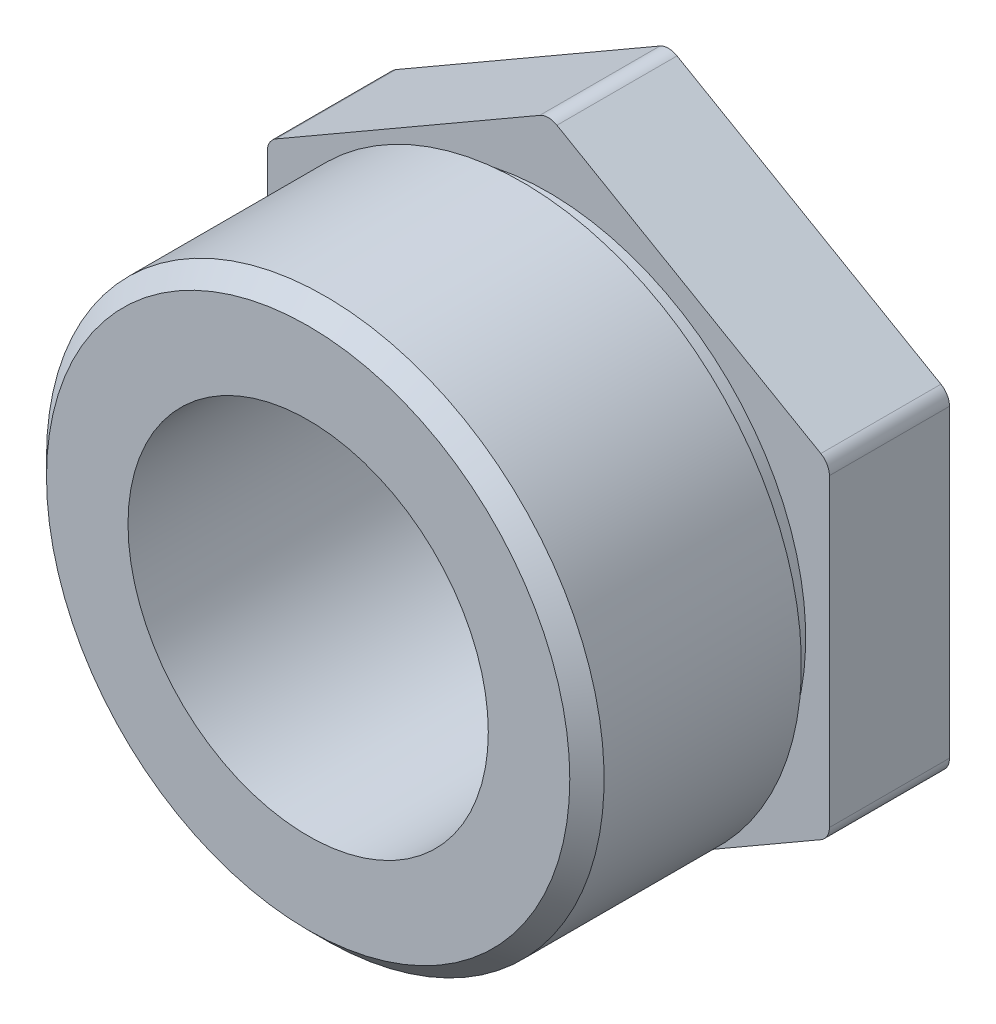
ISO-10303-21;
HEADER;
FILE_DESCRIPTION(('STEP AP214'),'2;1');
FILE_NAME('part.step','',(''),(''),'','','');
FILE_SCHEMA(('AUTOMOTIVE_DESIGN { 1 0 10303 214 1 1 1 1 }'));
ENDSEC;
DATA;
#1=APPLICATION_CONTEXT('core data for automotive mechanical design processes');
#2=APPLICATION_PROTOCOL_DEFINITION('international standard','automotive_design',2000,#1);
#3=PRODUCT_CONTEXT('',#1,'mechanical');
#4=PRODUCT('Part','Part','',(#3));
#5=PRODUCT_RELATED_PRODUCT_CATEGORY('part','',(#4));
#6=PRODUCT_DEFINITION_FORMATION('','',#4);
#7=PRODUCT_DEFINITION_CONTEXT('part definition',#1,'design');
#8=PRODUCT_DEFINITION('design','',#6,#7);
#9=PRODUCT_DEFINITION_SHAPE('','',#8);
#10=(LENGTH_UNIT() NAMED_UNIT(*) SI_UNIT(.MILLI.,.METRE.));
#11=(NAMED_UNIT(*) PLANE_ANGLE_UNIT() SI_UNIT($,.RADIAN.));
#12=(NAMED_UNIT(*) SI_UNIT($,.STERADIAN.) SOLID_ANGLE_UNIT());
#13=UNCERTAINTY_MEASURE_WITH_UNIT(LENGTH_MEASURE(1.E-05),#10,'distance_accuracy_value','');
#14=(GEOMETRIC_REPRESENTATION_CONTEXT(3) GLOBAL_UNCERTAINTY_ASSIGNED_CONTEXT((#13)) GLOBAL_UNIT_ASSIGNED_CONTEXT((#10,
#11,#12)) REPRESENTATION_CONTEXT('',''));
#15=CARTESIAN_POINT('',(0.,0.,0.));
#16=DIRECTION('',(0.,0.,1.));
#17=DIRECTION('',(1.,0.,0.));
#18=AXIS2_PLACEMENT_3D('',#15,#16,#17);
#19=CARTESIAN_POINT('',(-4.44089209850063E-13,0.,42.));
#20=DIRECTION('',(0.,0.,-1.));
#21=DIRECTION('',(-0.999999999999999,0.,0.));
#22=AXIS2_PLACEMENT_3D('',#19,#20,#21);
#23=CYLINDRICAL_SURFACE('',#22,32.5);
#24=CARTESIAN_POINT('',(-5.55111512312578E-13,-4.44089209850063E-13,40.));
#25=DIRECTION('',(0.,0.,1.));
#26=DIRECTION('',(0.999999999999999,0.,0.));
#27=AXIS2_PLACEMENT_3D('',#24,#25,#26);
#28=CIRCLE('',#27,32.5);
#29=CARTESIAN_POINT('',(-32.5000000000004,0.,40.));
#30=VERTEX_POINT('',#29);
#31=EDGE_CURVE('E13',#30,#30,#28,.F.);
#32=CARTESIAN_POINT('',(0.,0.,17.0000000000006));
#33=DIRECTION('',(0.,0.,1.));
#34=DIRECTION('',(0.999999999999999,0.,0.));
#35=AXIS2_PLACEMENT_3D('',#32,#33,#34);
#36=CIRCLE('',#35,32.5);
#37=CARTESIAN_POINT('',(-32.5000000000004,0.,17.0000000000006));
#38=VERTEX_POINT('',#37);
#39=EDGE_CURVE('E179',#38,#38,#36,.T.);
#40=CARTESIAN_POINT('',(-32.5000000000004,0.,40.));
#41=CARTESIAN_POINT('',(-32.5000000000004,0.,39.7604166666667));
#42=CARTESIAN_POINT('',(-32.5000000000004,0.,39.5208333333334));
#43=CARTESIAN_POINT('',(-32.5000000000004,0.,39.0416666666667));
#44=CARTESIAN_POINT('',(-32.5000000000004,0.,38.8020833333334));
#45=CARTESIAN_POINT('',(-32.5000000000004,0.,38.3229166666667));
#46=CARTESIAN_POINT('',(-32.5000000000004,0.,38.0833333333334));
#47=CARTESIAN_POINT('',(-32.5000000000004,0.,37.6041666666668));
#48=CARTESIAN_POINT('',(-32.5000000000004,0.,37.3645833333334));
#49=CARTESIAN_POINT('',(-32.5000000000004,0.,36.8854166666668));
#50=CARTESIAN_POINT('',(-32.5000000000004,0.,36.6458333333334));
#51=CARTESIAN_POINT('',(-32.5000000000004,0.,36.1666666666668));
#52=CARTESIAN_POINT('',(-32.5000000000004,0.,35.9270833333335));
#53=CARTESIAN_POINT('',(-32.5000000000004,0.,35.4479166666668));
#54=CARTESIAN_POINT('',(-32.5000000000004,0.,35.2083333333335));
#55=CARTESIAN_POINT('',(-32.5000000000004,0.,34.7291666666668));
#56=CARTESIAN_POINT('',(-32.5000000000004,0.,34.4895833333335));
#57=CARTESIAN_POINT('',(-32.5000000000004,0.,34.0104166666668));
#58=CARTESIAN_POINT('',(-32.5000000000004,0.,33.7708333333335));
#59=CARTESIAN_POINT('',(-32.5000000000004,0.,33.2916666666669));
#60=CARTESIAN_POINT('',(-32.5000000000004,0.,33.0520833333335));
#61=CARTESIAN_POINT('',(-32.5000000000004,0.,32.5729166666669));
#62=CARTESIAN_POINT('',(-32.5000000000004,0.,32.3333333333335));
#63=CARTESIAN_POINT('',(-32.5000000000004,0.,31.8541666666669));
#64=CARTESIAN_POINT('',(-32.5000000000004,0.,31.6145833333336));
#65=CARTESIAN_POINT('',(-32.5000000000004,0.,31.1354166666669));
#66=CARTESIAN_POINT('',(-32.5000000000004,0.,30.8958333333336));
#67=CARTESIAN_POINT('',(-32.5000000000004,0.,30.4166666666669));
#68=CARTESIAN_POINT('',(-32.5000000000004,0.,30.1770833333336));
#69=CARTESIAN_POINT('',(-32.5000000000004,0.,29.6979166666669));
#70=CARTESIAN_POINT('',(-32.5000000000004,0.,29.4583333333336));
#71=CARTESIAN_POINT('',(-32.5000000000004,0.,28.979166666667));
#72=CARTESIAN_POINT('',(-32.5000000000004,0.,28.7395833333336));
#73=CARTESIAN_POINT('',(-32.5000000000004,0.,28.260416666667));
#74=CARTESIAN_POINT('',(-32.5000000000004,0.,28.0208333333336));
#75=CARTESIAN_POINT('',(-32.5000000000004,0.,27.541666666667));
#76=CARTESIAN_POINT('',(-32.5000000000004,0.,27.3020833333337));
#77=CARTESIAN_POINT('',(-32.5000000000004,0.,26.822916666667));
#78=CARTESIAN_POINT('',(-32.5000000000004,0.,26.5833333333337));
#79=CARTESIAN_POINT('',(-32.5000000000004,0.,26.104166666667));
#80=CARTESIAN_POINT('',(-32.5000000000004,0.,25.8645833333337));
#81=CARTESIAN_POINT('',(-32.5000000000004,0.,25.385416666667));
#82=CARTESIAN_POINT('',(-32.5000000000004,0.,25.1458333333337));
#83=CARTESIAN_POINT('',(-32.5000000000004,0.,24.6666666666671));
#84=CARTESIAN_POINT('',(-32.5000000000004,0.,24.4270833333337));
#85=CARTESIAN_POINT('',(-32.5000000000004,0.,23.9479166666671));
#86=CARTESIAN_POINT('',(-32.5000000000004,0.,23.7083333333337));
#87=CARTESIAN_POINT('',(-32.5000000000004,0.,23.2291666666671));
#88=CARTESIAN_POINT('',(-32.5000000000004,0.,22.9895833333338));
#89=CARTESIAN_POINT('',(-32.5000000000004,0.,22.5104166666671));
#90=CARTESIAN_POINT('',(-32.5000000000004,0.,22.2708333333338));
#91=CARTESIAN_POINT('',(-32.5000000000004,0.,21.7916666666671));
#92=CARTESIAN_POINT('',(-32.5000000000004,0.,21.5520833333338));
#93=CARTESIAN_POINT('',(-32.5000000000004,0.,21.0729166666671));
#94=CARTESIAN_POINT('',(-32.5000000000004,0.,20.8333333333338));
#95=CARTESIAN_POINT('',(-32.5000000000004,0.,20.3541666666672));
#96=CARTESIAN_POINT('',(-32.5000000000004,0.,20.1145833333338));
#97=CARTESIAN_POINT('',(-32.5000000000004,0.,19.6354166666672));
#98=CARTESIAN_POINT('',(-32.5000000000004,0.,19.3958333333338));
#99=CARTESIAN_POINT('',(-32.5000000000004,0.,18.9166666666672));
#100=CARTESIAN_POINT('',(-32.5000000000004,0.,18.6770833333339));
#101=CARTESIAN_POINT('',(-32.5000000000004,0.,18.1979166666672));
#102=CARTESIAN_POINT('',(-32.5000000000004,0.,17.9583333333339));
#103=CARTESIAN_POINT('',(-32.5000000000004,0.,17.4791666666672));
#104=CARTESIAN_POINT('',(-32.5000000000004,0.,17.2395833333339));
#105=CARTESIAN_POINT('',(-32.5000000000004,0.,17.0000000000006));
#106=B_SPLINE_CURVE_WITH_KNOTS('',3,(#40,#41,#42,#43,#44,#45,#46,#47,#48,#49,#50,#51,#52,#53,
#54,#55,#56,#57,#58,#59,#60,#61,#62,#63,#64,#65,#66,#67,#68,#69,#70,#71,#72,#73,#74,#75,#76,#77,
#78,#79,#80,#81,#82,#83,#84,#85,#86,#87,#88,#89,#90,#91,#92,#93,#94,#95,#96,#97,#98,#99,#100,
#101,#102,#103,#104,#105),.UNSPECIFIED.,.F.,.F.,(4,2,2,2,2,2,2,2,2,2,2,2,2,2,2,2,2,2,2,2,2,2,2,
2,2,2,2,2,2,2,2,2,4),(0.,0.718749999999983,1.43749999999997,2.15624999999995,2.87499999999994,
3.59374999999992,4.31249999999991,5.03124999999989,5.74999999999987,6.46874999999986,
7.18749999999984,7.90624999999982,8.62499999999981,9.34374999999979,10.0624999999998,
10.7812499999998,11.4999999999997,12.2187499999997,12.9374999999997,13.6562499999997,
14.3749999999997,15.0937499999997,15.8124999999996,16.5312499999996,17.2499999999996,
17.9687499999996,18.6874999999996,19.4062499999996,20.1249999999995,20.8437499999995,
21.5624999999995,22.2812499999995,22.9999999999995),.UNSPECIFIED.);
#107=EDGE_CURVE('BSEAM56',#30,#38,#106,.T.);
#108=ORIENTED_EDGE('',*,*,#31,.T.);
#109=ORIENTED_EDGE('',*,*,#39,.T.);
#110=ORIENTED_EDGE('',*,*,#107,.T.);
#111=ORIENTED_EDGE('',*,*,#107,.F.);
#112=EDGE_LOOP('',(#108,#110,#109,#111));
#113=FACE_BOUND('',#112,.T.);
#114=ADVANCED_FACE('F56',(#113),#23,.T.);
#115=CARTESIAN_POINT('',(-4.44089209850063E-13,0.,42.));
#116=DIRECTION('',(0.,0.,1.));
#117=DIRECTION('',(0.999999999999999,0.,0.));
#118=AXIS2_PLACEMENT_3D('',#115,#116,#117);
#119=PLANE('',#118);
#120=CARTESIAN_POINT('',(-4.44089209850063E-13,0.,42.));
#121=DIRECTION('',(0.,0.,1.));
#122=DIRECTION('',(0.999999999999999,0.,0.));
#123=AXIS2_PLACEMENT_3D('',#120,#121,#122);
#124=CIRCLE('',#123,21.);
#125=CARTESIAN_POINT('',(21.,0.,42.));
#126=VERTEX_POINT('',#125);
#127=EDGE_CURVE('E519',#126,#126,#124,.T.);
#128=ORIENTED_EDGE('',*,*,#127,.F.);
#129=EDGE_LOOP('',(#128));
#130=FACE_BOUND('',#129,.T.);
#131=CARTESIAN_POINT('',(-4.44089209850063E-13,0.,42.));
#132=DIRECTION('',(0.,0.,1.));
#133=DIRECTION('',(0.999999999999999,0.,0.));
#134=AXIS2_PLACEMENT_3D('',#131,#132,#133);
#135=CIRCLE('',#134,30.5000000000001);
#136=CARTESIAN_POINT('',(-30.5000000000005,0.,42.));
#137=VERTEX_POINT('',#136);
#138=EDGE_CURVE('E66',#137,#137,#135,.T.);
#139=ORIENTED_EDGE('',*,*,#138,.T.);
#140=EDGE_LOOP('',(#139));
#141=FACE_BOUND('',#140,.T.);
#142=ADVANCED_FACE('F256',(#130,#141),#119,.T.);
#143=CARTESIAN_POINT('',(0.,0.,17.0000000000006));
#144=DIRECTION('',(0.,0.,1.));
#145=DIRECTION('',(0.999999999999999,0.,0.));
#146=AXIS2_PLACEMENT_3D('',#143,#144,#145);
#147=PLANE('',#146);
#148=ORIENTED_EDGE('',*,*,#39,.F.);
#149=EDGE_LOOP('',(#148));
#150=FACE_BOUND('',#149,.T.);
#151=CARTESIAN_POINT('',(0.,0.,17.0000000000006));
#152=DIRECTION('',(0.,0.,1.));
#153=DIRECTION('',(0.999999999999999,0.,0.));
#154=AXIS2_PLACEMENT_3D('',#151,#152,#153);
#155=CIRCLE('',#154,30.);
#156=CARTESIAN_POINT('',(-30.,0.,17.0000000000006));
#157=VERTEX_POINT('',#156);
#158=EDGE_CURVE('E187',#157,#157,#155,.T.);
#159=ORIENTED_EDGE('',*,*,#158,.T.);
#160=EDGE_LOOP('',(#159));
#161=FACE_BOUND('',#160,.T.);
#162=ADVANCED_FACE('F277',(#150,#161),#147,.F.);
#163=CARTESIAN_POINT('',(-2.22044604925031E-13,-2.22044604925031E-12,14.0000000000002));
#164=DIRECTION('',(0.,0.,1.));
#165=DIRECTION('',(0.999999999999999,0.,0.));
#166=AXIS2_PLACEMENT_3D('',#163,#164,#165);
#167=PLANE('',#166);
#168=CARTESIAN_POINT('',(-2.22044604925031E-13,-2.22044604925031E-12,14.0000000000002));
#169=DIRECTION('',(0.,0.,1.));
#170=DIRECTION('',(0.999999999999999,0.,0.));
#171=AXIS2_PLACEMENT_3D('',#168,#169,#170);
#172=CIRCLE('',#171,30.);
#173=CARTESIAN_POINT('',(-30.,0.,14.0000000000002));
#174=VERTEX_POINT('',#173);
#175=EDGE_CURVE('E324',#174,#174,#172,.T.);
#176=ORIENTED_EDGE('',*,*,#175,.F.);
#177=EDGE_LOOP('',(#176));
#178=FACE_BOUND('',#177,.T.);
#179=DIRECTION('',(-0.866025403784438,0.5,0.));
#180=VECTOR('',#179,1.);
#181=CARTESIAN_POINT('',(2.22044604925031E-13,-37.8287669515216,13.9999999999998));
#182=LINE('',#181,#180);
#183=CARTESIAN_POINT('',(-0.999999999999668,-37.2514166823326,14.));
#184=VERTEX_POINT('',#183);
#185=CARTESIAN_POINT('',(-31.7606731738591,-19.4917337449505,14.0000000000002));
#186=VERTEX_POINT('',#185);
#187=EDGE_CURVE('E528',#184,#186,#182,.T.);
#188=ORIENTED_EDGE('',*,*,#187,.F.);
#189=CARTESIAN_POINT('',(6.66133814775094E-13,-35.5193658747637,13.9999999999998));
#190=DIRECTION('',(0.,0.,1.));
#191=DIRECTION('',(0.999999999999999,0.,0.));
#192=AXIS2_PLACEMENT_3D('',#189,#190,#191);
#193=CIRCLE('',#192,2.);
#194=CARTESIAN_POINT('',(0.999999999999668,-37.2514166823339,14.));
#195=VERTEX_POINT('',#194);
#196=EDGE_CURVE('E223',#184,#195,#193,.T.);
#197=ORIENTED_EDGE('',*,*,#196,.T.);
#198=DIRECTION('',(-0.866025403784438,-0.500000000000001,0.));
#199=VECTOR('',#198,1.);
#200=CARTESIAN_POINT('',(32.7606731738592,-18.914383475761,14.0000000000005));
#201=LINE('',#200,#199);
#202=CARTESIAN_POINT('',(31.7606731738596,-19.4917337449505,14.));
#203=VERTEX_POINT('',#202);
#204=EDGE_CURVE('E347',#203,#195,#201,.T.);
#205=ORIENTED_EDGE('',*,*,#204,.F.);
#206=CARTESIAN_POINT('',(30.760673173859,-17.7596829373816,14.));
#207=DIRECTION('',(0.,0.,1.));
#208=DIRECTION('',(0.999999999999999,0.,0.));
#209=AXIS2_PLACEMENT_3D('',#206,#207,#208);
#210=CIRCLE('',#209,2.);
#211=CARTESIAN_POINT('',(32.760673173859,-17.7596829373825,14.));
#212=VERTEX_POINT('',#211);
#213=EDGE_CURVE('E177',#203,#212,#210,.T.);
#214=ORIENTED_EDGE('',*,*,#213,.T.);
#215=DIRECTION('',(0.,-1.,0.));
#216=VECTOR('',#215,1.);
#217=CARTESIAN_POINT('',(32.7606731738594,18.914383475761,14.0000000000005));
#218=LINE('',#217,#216);
#219=CARTESIAN_POINT('',(32.760673173859,17.7596829373816,14.));
#220=VERTEX_POINT('',#219);
#221=EDGE_CURVE('E312',#220,#212,#218,.T.);
#222=ORIENTED_EDGE('',*,*,#221,.F.);
#223=CARTESIAN_POINT('',(30.760673173859,17.7596829373816,14.));
#224=DIRECTION('',(0.,0.,1.));
#225=DIRECTION('',(0.999999999999999,0.,0.));
#226=AXIS2_PLACEMENT_3D('',#223,#224,#225);
#227=CIRCLE('',#226,2.);
#228=CARTESIAN_POINT('',(31.7606731738588,19.4917337449492,14.));
#229=VERTEX_POINT('',#228);
#230=EDGE_CURVE('E213',#220,#229,#227,.T.);
#231=ORIENTED_EDGE('',*,*,#230,.T.);
#232=DIRECTION('',(0.866025403784438,-0.5,0.));
#233=VECTOR('',#232,1.);
#234=CARTESIAN_POINT('',(-2.22044604925031E-13,37.8287669515214,13.9999999999998));
#235=LINE('',#234,#233);
#236=CARTESIAN_POINT('',(1.,37.2514166823326,14.0000000000007));
#237=VERTEX_POINT('',#236);
#238=EDGE_CURVE('E309',#237,#229,#235,.T.);
#239=ORIENTED_EDGE('',*,*,#238,.F.);
#240=CARTESIAN_POINT('',(0.,35.5193658747632,14.));
#241=DIRECTION('',(0.,0.,1.));
#242=DIRECTION('',(0.999999999999999,0.,0.));
#243=AXIS2_PLACEMENT_3D('',#240,#241,#242);
#244=CIRCLE('',#243,2.);
#245=CARTESIAN_POINT('',(-0.999999999999779,37.2514166823326,14.0000000000002));
#246=VERTEX_POINT('',#245);
#247=EDGE_CURVE('E210',#237,#246,#244,.T.);
#248=ORIENTED_EDGE('',*,*,#247,.T.);
#249=DIRECTION('',(0.866025403784438,0.500000000000001,0.));
#250=VECTOR('',#249,1.);
#251=CARTESIAN_POINT('',(-32.760673173859,18.914383475761,13.9999999999998));
#252=LINE('',#251,#250);
#253=CARTESIAN_POINT('',(-31.7606731738589,19.4917337449496,14.));
#254=VERTEX_POINT('',#253);
#255=EDGE_CURVE('E319',#254,#246,#252,.T.);
#256=ORIENTED_EDGE('',*,*,#255,.F.);
#257=CARTESIAN_POINT('',(-30.7606731738588,17.7596829373816,14.));
#258=DIRECTION('',(0.,0.,1.));
#259=DIRECTION('',(0.999999999999999,0.,0.));
#260=AXIS2_PLACEMENT_3D('',#257,#258,#259);
#261=CIRCLE('',#260,2.);
#262=CARTESIAN_POINT('',(-32.7606731738589,17.7596829373821,14.));
#263=VERTEX_POINT('',#262);
#264=EDGE_CURVE('E73',#254,#263,#261,.T.);
#265=ORIENTED_EDGE('',*,*,#264,.T.);
#266=DIRECTION('',(0.,1.,0.));
#267=VECTOR('',#266,1.);
#268=CARTESIAN_POINT('',(-32.7606731738588,-18.9143834757615,13.9999999999998));
#269=LINE('',#268,#267);
#270=CARTESIAN_POINT('',(-32.7606731738593,-17.7596829373834,13.9999999999996));
#271=VERTEX_POINT('',#270);
#272=EDGE_CURVE('E327',#271,#263,#269,.T.);
#273=ORIENTED_EDGE('',*,*,#272,.F.);
#274=CARTESIAN_POINT('',(-30.760673173859,-17.7596829373816,14.));
#275=DIRECTION('',(0.,0.,1.));
#276=DIRECTION('',(0.999999999999999,0.,0.));
#277=AXIS2_PLACEMENT_3D('',#274,#275,#276);
#278=CIRCLE('',#277,2.);
#279=EDGE_CURVE('E220',#271,#186,#278,.T.);
#280=ORIENTED_EDGE('',*,*,#279,.T.);
#281=EDGE_LOOP('',(#188,#197,#205,#214,#222,#231,#239,#248,#256,#265,#273,#280));
#282=FACE_BOUND('',#281,.T.);
#283=ADVANCED_FACE('F308',(#178,#282),#167,.T.);
#284=CARTESIAN_POINT('',(0.,0.,17.0000000000006));
#285=DIRECTION('',(0.,0.,-1.));
#286=DIRECTION('',(-0.999999999999999,0.,0.));
#287=AXIS2_PLACEMENT_3D('',#284,#285,#286);
#288=CYLINDRICAL_SURFACE('',#287,30.);
#289=CARTESIAN_POINT('',(-30.,0.,17.0000000000006));
#290=CARTESIAN_POINT('',(-30.,0.,16.9687500000006));
#291=CARTESIAN_POINT('',(-30.,0.,16.9375000000006));
#292=CARTESIAN_POINT('',(-30.,0.,16.8750000000006));
#293=CARTESIAN_POINT('',(-30.,0.,16.8437500000006));
#294=CARTESIAN_POINT('',(-30.,0.,16.7812500000005));
#295=CARTESIAN_POINT('',(-30.,0.,16.7500000000005));
#296=CARTESIAN_POINT('',(-30.,0.,16.6875000000005));
#297=CARTESIAN_POINT('',(-30.,0.,16.6562500000005));
#298=CARTESIAN_POINT('',(-30.,0.,16.5937500000005));
#299=CARTESIAN_POINT('',(-30.,0.,16.5625000000005));
#300=CARTESIAN_POINT('',(-30.,0.,16.5000000000005));
#301=CARTESIAN_POINT('',(-30.,0.,16.4687500000005));
#302=CARTESIAN_POINT('',(-30.,0.,16.4062500000005));
#303=CARTESIAN_POINT('',(-30.,0.,16.3750000000005));
#304=CARTESIAN_POINT('',(-30.,0.,16.3125000000005));
#305=CARTESIAN_POINT('',(-30.,0.,16.2812500000005));
#306=CARTESIAN_POINT('',(-30.,0.,16.2187500000005));
#307=CARTESIAN_POINT('',(-30.,0.,16.1875000000005));
#308=CARTESIAN_POINT('',(-30.,0.,16.1250000000005));
#309=CARTESIAN_POINT('',(-30.,0.,16.0937500000005));
#310=CARTESIAN_POINT('',(-30.,0.,16.0312500000005));
#311=CARTESIAN_POINT('',(-30.,0.,16.0000000000005));
#312=CARTESIAN_POINT('',(-30.,0.,15.9375000000005));
#313=CARTESIAN_POINT('',(-30.,0.,15.9062500000004));
#314=CARTESIAN_POINT('',(-30.,0.,15.8437500000004));
#315=CARTESIAN_POINT('',(-30.,0.,15.8125000000004));
#316=CARTESIAN_POINT('',(-30.,0.,15.7500000000004));
#317=CARTESIAN_POINT('',(-30.,0.,15.7187500000004));
#318=CARTESIAN_POINT('',(-30.,0.,15.6562500000004));
#319=CARTESIAN_POINT('',(-30.,0.,15.6250000000004));
#320=CARTESIAN_POINT('',(-30.,0.,15.5625000000004));
#321=CARTESIAN_POINT('',(-30.,0.,15.5312500000004));
#322=CARTESIAN_POINT('',(-30.,0.,15.4687500000004));
#323=CARTESIAN_POINT('',(-30.,0.,15.4375000000004));
#324=CARTESIAN_POINT('',(-30.,0.,15.3750000000004));
#325=CARTESIAN_POINT('',(-30.,0.,15.3437500000004));
#326=CARTESIAN_POINT('',(-30.,0.,15.2812500000004));
#327=CARTESIAN_POINT('',(-30.,0.,15.2500000000004));
#328=CARTESIAN_POINT('',(-30.,0.,15.1875000000004));
#329=CARTESIAN_POINT('',(-30.,0.,15.1562500000004));
#330=CARTESIAN_POINT('',(-30.,0.,15.0937500000004));
#331=CARTESIAN_POINT('',(-30.,0.,15.0625000000004));
#332=CARTESIAN_POINT('',(-30.,0.,15.0000000000003));
#333=CARTESIAN_POINT('',(-30.,0.,14.9687500000003));
#334=CARTESIAN_POINT('',(-30.,0.,14.9062500000003));
#335=CARTESIAN_POINT('',(-30.,0.,14.8750000000003));
#336=CARTESIAN_POINT('',(-30.,0.,14.8125000000003));
#337=CARTESIAN_POINT('',(-30.,0.,14.7812500000003));
#338=CARTESIAN_POINT('',(-30.,0.,14.7187500000003));
#339=CARTESIAN_POINT('',(-30.,0.,14.6875000000003));
#340=CARTESIAN_POINT('',(-30.,0.,14.6250000000003));
#341=CARTESIAN_POINT('',(-30.,0.,14.5937500000003));
#342=CARTESIAN_POINT('',(-30.,0.,14.5312500000003));
#343=CARTESIAN_POINT('',(-30.,0.,14.5000000000003));
#344=CARTESIAN_POINT('',(-30.,0.,14.4375000000003));
#345=CARTESIAN_POINT('',(-30.,0.,14.4062500000003));
#346=CARTESIAN_POINT('',(-30.,0.,14.3437500000003));
#347=CARTESIAN_POINT('',(-30.,0.,14.3125000000003));
#348=CARTESIAN_POINT('',(-30.,0.,14.2500000000003));
#349=CARTESIAN_POINT('',(-30.,0.,14.2187500000003));
#350=CARTESIAN_POINT('',(-30.,0.,14.1562500000003));
#351=CARTESIAN_POINT('',(-30.,0.,14.1250000000003));
#352=CARTESIAN_POINT('',(-30.,0.,14.0625000000002));
#353=CARTESIAN_POINT('',(-30.,0.,14.0312500000002));
#354=CARTESIAN_POINT('',(-30.,0.,14.0000000000002));
#355=B_SPLINE_CURVE_WITH_KNOTS('',3,(#289,#290,#291,#292,#293,#294,#295,#296,#297,#298,#299,
#300,#301,#302,#303,#304,#305,#306,#307,#308,#309,#310,#311,#312,#313,#314,#315,#316,#317,#318,
#319,#320,#321,#322,#323,#324,#325,#326,#327,#328,#329,#330,#331,#332,#333,#334,#335,#336,#337,
#338,#339,#340,#341,#342,#343,#344,#345,#346,#347,#348,#349,#350,#351,#352,#353,#354),
.UNSPECIFIED.,.F.,.F.,(4,2,2,2,2,2,2,2,2,2,2,2,2,2,2,2,2,2,2,2,2,2,2,2,2,2,2,2,2,2,2,2,4),(0.,
0.0937500000000105,0.187500000000021,0.281250000000031,0.375000000000042,0.468750000000052,
0.562500000000063,0.656250000000073,0.750000000000084,0.843750000000094,0.937500000000105,
1.03125000000012,1.12500000000013,1.21875000000014,1.31250000000015,1.40625000000016,
1.50000000000017,1.59375000000018,1.68750000000019,1.7812500000002,1.87500000000021,
1.96875000000022,2.06250000000023,2.15625000000024,2.25000000000025,2.34375000000026,
2.43750000000027,2.53125000000028,2.62500000000029,2.7187500000003,2.81250000000031,
2.90625000000032,3.00000000000033),.UNSPECIFIED.);
#356=EDGE_CURVE('BSEAM355',#157,#174,#355,.T.);
#357=ORIENTED_EDGE('',*,*,#158,.F.);
#358=ORIENTED_EDGE('',*,*,#175,.T.);
#359=ORIENTED_EDGE('',*,*,#356,.T.);
#360=ORIENTED_EDGE('',*,*,#356,.F.);
#361=EDGE_LOOP('',(#357,#359,#358,#360));
#362=FACE_BOUND('',#361,.T.);
#363=ADVANCED_FACE('F355',(#362),#288,.T.);
#364=CARTESIAN_POINT('',(32.7606731738592,-18.914383475761,14.0000000000005));
#365=DIRECTION('',(0.5,-0.866025403784439,0.));
#366=DIRECTION('',(0.866025403784438,0.500000000000001,0.));
#367=AXIS2_PLACEMENT_3D('',#364,#365,#366);
#368=PLANE('',#367);
#369=ORIENTED_EDGE('',*,*,#204,.T.);
#370=DIRECTION('',(0.,0.,-1.));
#371=VECTOR('',#370,1.);
#372=CARTESIAN_POINT('',(0.999999999999668,-37.2514166823339,14.));
#373=LINE('',#372,#371);
#374=CARTESIAN_POINT('',(0.99999999999989,-37.2514166823321,0.));
#375=VERTEX_POINT('',#374);
#376=EDGE_CURVE('E170',#195,#375,#373,.T.);
#377=ORIENTED_EDGE('',*,*,#376,.T.);
#378=DIRECTION('',(-0.866025403784438,-0.500000000000001,0.));
#379=VECTOR('',#378,1.);
#380=CARTESIAN_POINT('',(32.760673173859,-18.9143834757606,0.));
#381=LINE('',#380,#379);
#382=CARTESIAN_POINT('',(31.7606731738583,-19.4917337449518,0.));
#383=VERTEX_POINT('',#382);
#384=EDGE_CURVE('E152',#383,#375,#381,.T.);
#385=ORIENTED_EDGE('',*,*,#384,.F.);
#386=DIRECTION('',(0.,0.,-1.));
#387=VECTOR('',#386,1.);
#388=CARTESIAN_POINT('',(31.7606731738596,-19.4917337449505,14.));
#389=LINE('',#388,#387);
#390=EDGE_CURVE('E167',#383,#203,#389,.F.);
#391=ORIENTED_EDGE('',*,*,#390,.T.);
#392=EDGE_LOOP('',(#369,#377,#385,#391));
#393=FACE_BOUND('',#392,.T.);
#394=ADVANCED_FACE('F166',(#393),#368,.T.);
#395=CARTESIAN_POINT('',(32.7606731738594,18.914383475761,14.0000000000005));
#396=DIRECTION('',(0.999999999999999,0.,0.));
#397=DIRECTION('',(0.,0.,-1.));
#398=AXIS2_PLACEMENT_3D('',#395,#396,#397);
#399=PLANE('',#398);
#400=ORIENTED_EDGE('',*,*,#221,.T.);
#401=DIRECTION('',(0.,0.,-1.));
#402=VECTOR('',#401,1.);
#403=CARTESIAN_POINT('',(32.760673173859,-17.7596829373825,14.));
#404=LINE('',#403,#402);
#405=CARTESIAN_POINT('',(32.7606731738591,-17.7596829373816,6.66133814775094E-13));
#406=VERTEX_POINT('',#405);
#407=EDGE_CURVE('E242',#212,#406,#404,.T.);
#408=ORIENTED_EDGE('',*,*,#407,.T.);
#409=DIRECTION('',(0.,-1.,0.));
#410=VECTOR('',#409,1.);
#411=CARTESIAN_POINT('',(32.7606731738588,18.9143834757606,0.));
#412=LINE('',#411,#410);
#413=CARTESIAN_POINT('',(32.760673173859,17.7596829373794,0.));
#414=VERTEX_POINT('',#413);
#415=EDGE_CURVE('E154',#414,#406,#412,.T.);
#416=ORIENTED_EDGE('',*,*,#415,.F.);
#417=DIRECTION('',(0.,0.,-1.));
#418=VECTOR('',#417,1.);
#419=CARTESIAN_POINT('',(32.760673173859,17.7596829373816,14.));
#420=LINE('',#419,#418);
#421=EDGE_CURVE('E239',#414,#220,#420,.F.);
#422=ORIENTED_EDGE('',*,*,#421,.T.);
#423=EDGE_LOOP('',(#400,#408,#416,#422));
#424=FACE_BOUND('',#423,.T.);
#425=ADVANCED_FACE('F370',(#424),#399,.T.);
#426=CARTESIAN_POINT('',(-2.22044604925031E-13,37.8287669515214,13.9999999999998));
#427=DIRECTION('',(0.499999999999999,0.86602540378444,0.));
#428=DIRECTION('',(-0.866025403784438,0.5,0.));
#429=AXIS2_PLACEMENT_3D('',#426,#427,#428);
#430=PLANE('',#429);
#431=ORIENTED_EDGE('',*,*,#238,.T.);
#432=DIRECTION('',(0.,0.,-1.));
#433=VECTOR('',#432,1.);
#434=CARTESIAN_POINT('',(31.7606731738588,19.4917337449492,14.));
#435=LINE('',#434,#433);
#436=CARTESIAN_POINT('',(31.760673173859,19.4917337449505,0.));
#437=VERTEX_POINT('',#436);
#438=EDGE_CURVE('E248',#229,#437,#435,.T.);
#439=ORIENTED_EDGE('',*,*,#438,.T.);
#440=DIRECTION('',(0.866025403784438,-0.5,0.));
#441=VECTOR('',#440,1.);
#442=CARTESIAN_POINT('',(-2.22044604925031E-13,37.8287669515216,-4.44089209850063E-13));
#443=LINE('',#442,#441);
#444=CARTESIAN_POINT('',(0.99999999999989,37.2514166823299,0.));
#445=VERTEX_POINT('',#444);
#446=EDGE_CURVE('E342',#445,#437,#443,.T.);
#447=ORIENTED_EDGE('',*,*,#446,.F.);
#448=DIRECTION('',(0.,0.,-1.));
#449=VECTOR('',#448,1.);
#450=CARTESIAN_POINT('',(1.,37.2514166823326,14.0000000000007));
#451=LINE('',#450,#449);
#452=EDGE_CURVE('E245',#445,#237,#451,.F.);
#453=ORIENTED_EDGE('',*,*,#452,.T.);
#454=EDGE_LOOP('',(#431,#439,#447,#453));
#455=FACE_BOUND('',#454,.T.);
#456=ADVANCED_FACE('F314',(#455),#430,.T.);
#457=CARTESIAN_POINT('',(-32.760673173859,18.914383475761,13.9999999999998));
#458=DIRECTION('',(-0.5,0.866025403784439,0.));
#459=DIRECTION('',(-0.866025403784438,-0.500000000000001,0.));
#460=AXIS2_PLACEMENT_3D('',#457,#458,#459);
#461=PLANE('',#460);
#462=DIRECTION('',(0.866025403784438,0.500000000000001,0.));
#463=VECTOR('',#462,1.);
#464=CARTESIAN_POINT('',(-32.7606731738584,18.914383475761,0.));
#465=LINE('',#464,#463);
#466=CARTESIAN_POINT('',(-31.7606731738593,19.4917337449514,4.44089209850063E-13));
#467=VERTEX_POINT('',#466);
#468=CARTESIAN_POINT('',(-1.,37.2514166823299,2.22044604925031E-13));
#469=VERTEX_POINT('',#468);
#470=EDGE_CURVE('E338',#467,#469,#465,.T.);
#471=ORIENTED_EDGE('',*,*,#470,.F.);
#472=DIRECTION('',(0.,0.,-1.));
#473=VECTOR('',#472,1.);
#474=CARTESIAN_POINT('',(-31.7606731738589,19.4917337449496,14.));
#475=LINE('',#474,#473);
#476=EDGE_CURVE('E236',#467,#254,#475,.F.);
#477=ORIENTED_EDGE('',*,*,#476,.T.);
#478=ORIENTED_EDGE('',*,*,#255,.T.);
#479=DIRECTION('',(0.,0.,-1.));
#480=VECTOR('',#479,1.);
#481=CARTESIAN_POINT('',(-0.999999999999779,37.2514166823326,14.0000000000002));
#482=LINE('',#481,#480);
#483=EDGE_CURVE('E232',#246,#469,#482,.T.);
#484=ORIENTED_EDGE('',*,*,#483,.T.);
#485=EDGE_LOOP('',(#471,#477,#478,#484));
#486=FACE_BOUND('',#485,.T.);
#487=ADVANCED_FACE('F378',(#486),#461,.T.);
#488=CARTESIAN_POINT('',(-32.7606731738588,-18.9143834757615,13.9999999999998));
#489=DIRECTION('',(-0.999999999999999,0.,0.));
#490=DIRECTION('',(0.,0.,1.));
#491=AXIS2_PLACEMENT_3D('',#488,#489,#490);
#492=PLANE('',#491);
#493=DIRECTION('',(0.,1.,0.));
#494=VECTOR('',#493,1.);
#495=CARTESIAN_POINT('',(-32.7606731738584,-18.914383475761,0.));
#496=LINE('',#495,#494);
#497=CARTESIAN_POINT('',(-32.7606731738592,-17.7596829373825,0.));
#498=VERTEX_POINT('',#497);
#499=CARTESIAN_POINT('',(-32.7606731738591,17.7596829373825,2.22044604925031E-13));
#500=VERTEX_POINT('',#499);
#501=EDGE_CURVE('E334',#498,#500,#496,.T.);
#502=ORIENTED_EDGE('',*,*,#501,.F.);
#503=DIRECTION('',(0.,0.,-1.));
#504=VECTOR('',#503,1.);
#505=CARTESIAN_POINT('',(-32.7606731738593,-17.7596829373834,13.9999999999996));
#506=LINE('',#505,#504);
#507=EDGE_CURVE('E80',#498,#271,#506,.F.);
#508=ORIENTED_EDGE('',*,*,#507,.T.);
#509=ORIENTED_EDGE('',*,*,#272,.T.);
#510=DIRECTION('',(0.,0.,-1.));
#511=VECTOR('',#510,1.);
#512=CARTESIAN_POINT('',(-32.7606731738589,17.7596829373821,14.));
#513=LINE('',#512,#511);
#514=EDGE_CURVE('E226',#263,#500,#513,.T.);
#515=ORIENTED_EDGE('',*,*,#514,.T.);
#516=EDGE_LOOP('',(#502,#508,#509,#515));
#517=FACE_BOUND('',#516,.T.);
#518=ADVANCED_FACE('F374',(#517),#492,.T.);
#519=CARTESIAN_POINT('',(2.22044604925031E-13,-37.8287669515216,13.9999999999998));
#520=DIRECTION('',(-0.499999999999999,-0.86602540378444,0.));
#521=DIRECTION('',(0.866025403784438,-0.5,0.));
#522=AXIS2_PLACEMENT_3D('',#519,#520,#521);
#523=PLANE('',#522);
#524=DIRECTION('',(-0.866025403784438,0.5,0.));
#525=VECTOR('',#524,1.);
#526=CARTESIAN_POINT('',(-2.22044604925031E-13,-37.8287669515238,4.44089209850063E-13));
#527=LINE('',#526,#525);
#528=CARTESIAN_POINT('',(-0.999999999999668,-37.2514166823321,-2.22044604925031E-13));
#529=VERTEX_POINT('',#528);
#530=CARTESIAN_POINT('',(-31.7606731738593,-19.4917337449505,0.));
#531=VERTEX_POINT('',#530);
#532=EDGE_CURVE('E172',#529,#531,#527,.T.);
#533=ORIENTED_EDGE('',*,*,#532,.F.);
#534=DIRECTION('',(0.,0.,-1.));
#535=VECTOR('',#534,1.);
#536=CARTESIAN_POINT('',(-0.999999999999668,-37.2514166823326,14.));
#537=LINE('',#536,#535);
#538=EDGE_CURVE('E207',#529,#184,#537,.F.);
#539=ORIENTED_EDGE('',*,*,#538,.T.);
#540=ORIENTED_EDGE('',*,*,#187,.T.);
#541=DIRECTION('',(0.,0.,-1.));
#542=VECTOR('',#541,1.);
#543=CARTESIAN_POINT('',(-31.7606731738591,-19.4917337449505,14.0000000000002));
#544=LINE('',#543,#542);
#545=EDGE_CURVE('E203',#186,#531,#544,.T.);
#546=ORIENTED_EDGE('',*,*,#545,.T.);
#547=EDGE_LOOP('',(#533,#539,#540,#546));
#548=FACE_BOUND('',#547,.T.);
#549=ADVANCED_FACE('F371',(#548),#523,.T.);
#550=CARTESIAN_POINT('',(0.,0.,0.));
#551=DIRECTION('',(0.,0.,1.));
#552=DIRECTION('',(0.999999999999999,0.,0.));
#553=AXIS2_PLACEMENT_3D('',#550,#551,#552);
#554=PLANE('',#553);
#555=CARTESIAN_POINT('',(0.,0.,0.));
#556=DIRECTION('',(0.,0.,1.));
#557=DIRECTION('',(0.999999999999999,0.,0.));
#558=AXIS2_PLACEMENT_3D('',#555,#556,#557);
#559=CIRCLE('',#558,21.);
#560=CARTESIAN_POINT('',(21.,0.,0.));
#561=VERTEX_POINT('',#560);
#562=EDGE_CURVE('E173',#561,#561,#559,.T.);
#563=ORIENTED_EDGE('',*,*,#562,.T.);
#564=EDGE_LOOP('',(#563));
#565=FACE_BOUND('',#564,.T.);
#566=ORIENTED_EDGE('',*,*,#384,.T.);
#567=CARTESIAN_POINT('',(0.,-35.5193658747632,0.));
#568=DIRECTION('',(0.,0.,1.));
#569=DIRECTION('',(0.999999999999999,0.,0.));
#570=AXIS2_PLACEMENT_3D('',#567,#568,#569);
#571=CIRCLE('',#570,2.);
#572=EDGE_CURVE('E200',#375,#529,#571,.F.);
#573=ORIENTED_EDGE('',*,*,#572,.T.);
#574=ORIENTED_EDGE('',*,*,#532,.T.);
#575=CARTESIAN_POINT('',(-30.760673173859,-17.7596829373829,-2.22044604925031E-13));
#576=DIRECTION('',(0.,0.,1.));
#577=DIRECTION('',(0.999999999999999,0.,0.));
#578=AXIS2_PLACEMENT_3D('',#575,#576,#577);
#579=CIRCLE('',#578,2.);
#580=EDGE_CURVE('E197',#531,#498,#579,.F.);
#581=ORIENTED_EDGE('',*,*,#580,.T.);
#582=ORIENTED_EDGE('',*,*,#501,.T.);
#583=CARTESIAN_POINT('',(-30.7606731738592,17.7596829373816,-2.22044604925031E-13));
#584=DIRECTION('',(0.,0.,1.));
#585=DIRECTION('',(0.999999999999999,0.,0.));
#586=AXIS2_PLACEMENT_3D('',#583,#584,#585);
#587=CIRCLE('',#586,2.);
#588=EDGE_CURVE('E160',#500,#467,#587,.F.);
#589=ORIENTED_EDGE('',*,*,#588,.T.);
#590=ORIENTED_EDGE('',*,*,#470,.T.);
#591=CARTESIAN_POINT('',(0.,35.5193658747632,0.));
#592=DIRECTION('',(0.,0.,1.));
#593=DIRECTION('',(0.999999999999999,0.,0.));
#594=AXIS2_PLACEMENT_3D('',#591,#592,#593);
#595=CIRCLE('',#594,2.);
#596=EDGE_CURVE('E184',#469,#445,#595,.F.);
#597=ORIENTED_EDGE('',*,*,#596,.T.);
#598=ORIENTED_EDGE('',*,*,#446,.T.);
#599=CARTESIAN_POINT('',(30.7606731738594,17.7596829373825,0.));
#600=DIRECTION('',(0.,0.,1.));
#601=DIRECTION('',(0.999999999999999,0.,0.));
#602=AXIS2_PLACEMENT_3D('',#599,#600,#601);
#603=CIRCLE('',#602,2.);
#604=EDGE_CURVE('E161',#437,#414,#603,.F.);
#605=ORIENTED_EDGE('',*,*,#604,.T.);
#606=ORIENTED_EDGE('',*,*,#415,.T.);
#607=CARTESIAN_POINT('',(30.7606731738594,-17.7596829373816,4.44089209850063E-13));
#608=DIRECTION('',(0.,0.,1.));
#609=DIRECTION('',(0.999999999999999,0.,0.));
#610=AXIS2_PLACEMENT_3D('',#607,#608,#609);
#611=CIRCLE('',#610,2.);
#612=EDGE_CURVE('E149',#406,#383,#611,.F.);
#613=ORIENTED_EDGE('',*,*,#612,.T.);
#614=EDGE_LOOP('',(#566,#573,#574,#581,#582,#589,#590,#597,#598,#605,#606,#613));
#615=FACE_BOUND('',#614,.T.);
#616=ADVANCED_FACE('F151',(#565,#615),#554,.F.);
#617=CARTESIAN_POINT('',(6.66133814775094E-13,-35.5193658747637,13.9999999999998));
#618=DIRECTION('',(0.,0.,-1.));
#619=DIRECTION('',(-0.999999999999999,0.,0.));
#620=AXIS2_PLACEMENT_3D('',#617,#618,#619);
#621=CYLINDRICAL_SURFACE('',#620,2.);
#622=ORIENTED_EDGE('',*,*,#196,.F.);
#623=ORIENTED_EDGE('',*,*,#538,.F.);
#624=ORIENTED_EDGE('',*,*,#572,.F.);
#625=ORIENTED_EDGE('',*,*,#376,.F.);
#626=EDGE_LOOP('',(#622,#623,#624,#625));
#627=FACE_BOUND('',#626,.T.);
#628=ADVANCED_FACE('F283',(#627),#621,.T.);
#629=CARTESIAN_POINT('',(-30.760673173859,-17.7596829373816,14.));
#630=DIRECTION('',(0.,0.,-1.));
#631=DIRECTION('',(-0.999999999999999,0.,0.));
#632=AXIS2_PLACEMENT_3D('',#629,#630,#631);
#633=CYLINDRICAL_SURFACE('',#632,2.);
#634=ORIENTED_EDGE('',*,*,#279,.F.);
#635=ORIENTED_EDGE('',*,*,#507,.F.);
#636=ORIENTED_EDGE('',*,*,#580,.F.);
#637=ORIENTED_EDGE('',*,*,#545,.F.);
#638=EDGE_LOOP('',(#634,#635,#636,#637));
#639=FACE_BOUND('',#638,.T.);
#640=ADVANCED_FACE('F286',(#639),#633,.T.);
#641=CARTESIAN_POINT('',(-30.7606731738588,17.7596829373816,14.));
#642=DIRECTION('',(0.,0.,-1.));
#643=DIRECTION('',(-0.999999999999999,0.,0.));
#644=AXIS2_PLACEMENT_3D('',#641,#642,#643);
#645=CYLINDRICAL_SURFACE('',#644,2.);
#646=ORIENTED_EDGE('',*,*,#264,.F.);
#647=ORIENTED_EDGE('',*,*,#476,.F.);
#648=ORIENTED_EDGE('',*,*,#588,.F.);
#649=ORIENTED_EDGE('',*,*,#514,.F.);
#650=EDGE_LOOP('',(#646,#647,#648,#649));
#651=FACE_BOUND('',#650,.T.);
#652=ADVANCED_FACE('F290',(#651),#645,.T.);
#653=CARTESIAN_POINT('',(30.760673173859,-17.7596829373816,14.));
#654=DIRECTION('',(0.,0.,-1.));
#655=DIRECTION('',(-0.999999999999999,0.,0.));
#656=AXIS2_PLACEMENT_3D('',#653,#654,#655);
#657=CYLINDRICAL_SURFACE('',#656,2.);
#658=ORIENTED_EDGE('',*,*,#213,.F.);
#659=ORIENTED_EDGE('',*,*,#390,.F.);
#660=ORIENTED_EDGE('',*,*,#612,.F.);
#661=ORIENTED_EDGE('',*,*,#407,.F.);
#662=EDGE_LOOP('',(#658,#659,#660,#661));
#663=FACE_BOUND('',#662,.T.);
#664=ADVANCED_FACE('F176',(#663),#657,.T.);
#665=CARTESIAN_POINT('',(30.760673173859,17.7596829373816,14.));
#666=DIRECTION('',(0.,0.,-1.));
#667=DIRECTION('',(-0.999999999999999,0.,0.));
#668=AXIS2_PLACEMENT_3D('',#665,#666,#667);
#669=CYLINDRICAL_SURFACE('',#668,2.);
#670=ORIENTED_EDGE('',*,*,#230,.F.);
#671=ORIENTED_EDGE('',*,*,#421,.F.);
#672=ORIENTED_EDGE('',*,*,#604,.F.);
#673=ORIENTED_EDGE('',*,*,#438,.F.);
#674=EDGE_LOOP('',(#670,#671,#672,#673));
#675=FACE_BOUND('',#674,.T.);
#676=ADVANCED_FACE('F268',(#675),#669,.T.);
#677=CARTESIAN_POINT('',(0.,35.5193658747632,14.));
#678=DIRECTION('',(0.,0.,-1.));
#679=DIRECTION('',(-0.999999999999999,0.,0.));
#680=AXIS2_PLACEMENT_3D('',#677,#678,#679);
#681=CYLINDRICAL_SURFACE('',#680,2.);
#682=ORIENTED_EDGE('',*,*,#247,.F.);
#683=ORIENTED_EDGE('',*,*,#452,.F.);
#684=ORIENTED_EDGE('',*,*,#596,.F.);
#685=ORIENTED_EDGE('',*,*,#483,.F.);
#686=EDGE_LOOP('',(#682,#683,#684,#685));
#687=FACE_BOUND('',#686,.T.);
#688=ADVANCED_FACE('F260',(#687),#681,.T.);
#689=CARTESIAN_POINT('',(-4.44089209850063E-13,0.,42.));
#690=DIRECTION('',(0.,0.,-1.));
#691=DIRECTION('',(-0.999999999999999,0.,0.));
#692=AXIS2_PLACEMENT_3D('',#689,#690,#691);
#693=CONICAL_SURFACE('',#692,30.5000000000001,0.785398163397447);
#694=CARTESIAN_POINT('',(-32.5000000000005,0.,40.));
#695=CARTESIAN_POINT('',(-32.4791666666671,0.,40.0208333333334));
#696=CARTESIAN_POINT('',(-32.4583333333338,0.,40.0416666666667));
#697=CARTESIAN_POINT('',(-32.4166666666671,0.,40.0833333333334));
#698=CARTESIAN_POINT('',(-32.3958333333338,0.,40.1041666666667));
#699=CARTESIAN_POINT('',(-32.3541666666671,0.,40.1458333333334));
#700=CARTESIAN_POINT('',(-32.3333333333338,0.,40.1666666666667));
#701=CARTESIAN_POINT('',(-32.2916666666671,0.,40.2083333333334));
#702=CARTESIAN_POINT('',(-32.2708333333338,0.,40.2291666666667));
#703=CARTESIAN_POINT('',(-32.2291666666671,0.,40.2708333333334));
#704=CARTESIAN_POINT('',(-32.2083333333338,0.,40.2916666666667));
#705=CARTESIAN_POINT('',(-32.1666666666671,0.,40.3333333333334));
#706=CARTESIAN_POINT('',(-32.1458333333338,0.,40.3541666666667));
#707=CARTESIAN_POINT('',(-32.1041666666671,0.,40.3958333333334));
#708=CARTESIAN_POINT('',(-32.0833333333338,0.,40.4166666666667));
#709=CARTESIAN_POINT('',(-32.0416666666671,0.,40.4583333333334));
#710=CARTESIAN_POINT('',(-32.0208333333338,0.,40.4791666666667));
#711=CARTESIAN_POINT('',(-31.9791666666671,0.,40.5208333333334));
#712=CARTESIAN_POINT('',(-31.9583333333338,0.,40.5416666666667));
#713=CARTESIAN_POINT('',(-31.9166666666671,0.,40.5833333333334));
#714=CARTESIAN_POINT('',(-31.8958333333338,0.,40.6041666666667));
#715=CARTESIAN_POINT('',(-31.8541666666671,0.,40.6458333333334));
#716=CARTESIAN_POINT('',(-31.8333333333338,0.,40.6666666666667));
#717=CARTESIAN_POINT('',(-31.7916666666671,0.,40.7083333333334));
#718=CARTESIAN_POINT('',(-31.7708333333338,0.,40.7291666666667));
#719=CARTESIAN_POINT('',(-31.7291666666671,0.,40.7708333333334));
#720=CARTESIAN_POINT('',(-31.7083333333338,0.,40.7916666666667));
#721=CARTESIAN_POINT('',(-31.6666666666671,0.,40.8333333333334));
#722=CARTESIAN_POINT('',(-31.6458333333338,0.,40.8541666666667));
#723=CARTESIAN_POINT('',(-31.6041666666671,0.,40.8958333333334));
#724=CARTESIAN_POINT('',(-31.5833333333338,0.,40.9166666666667));
#725=CARTESIAN_POINT('',(-31.5416666666671,0.,40.9583333333334));
#726=CARTESIAN_POINT('',(-31.5208333333338,0.,40.9791666666667));
#727=CARTESIAN_POINT('',(-31.4791666666671,0.,41.0208333333334));
#728=CARTESIAN_POINT('',(-31.4583333333338,0.,41.0416666666667));
#729=CARTESIAN_POINT('',(-31.4166666666671,0.,41.0833333333334));
#730=CARTESIAN_POINT('',(-31.3958333333338,0.,41.1041666666667));
#731=CARTESIAN_POINT('',(-31.3541666666671,0.,41.1458333333334));
#732=CARTESIAN_POINT('',(-31.3333333333338,0.,41.1666666666667));
#733=CARTESIAN_POINT('',(-31.2916666666671,0.,41.2083333333334));
#734=CARTESIAN_POINT('',(-31.2708333333338,0.,41.2291666666667));
#735=CARTESIAN_POINT('',(-31.2291666666671,0.,41.2708333333334));
#736=CARTESIAN_POINT('',(-31.2083333333338,0.,41.2916666666667));
#737=CARTESIAN_POINT('',(-31.1666666666671,0.,41.3333333333334));
#738=CARTESIAN_POINT('',(-31.1458333333338,0.,41.3541666666667));
#739=CARTESIAN_POINT('',(-31.1041666666671,0.,41.3958333333334));
#740=CARTESIAN_POINT('',(-31.0833333333338,0.,41.4166666666667));
#741=CARTESIAN_POINT('',(-31.0416666666671,0.,41.4583333333334));
#742=CARTESIAN_POINT('',(-31.0208333333338,0.,41.4791666666667));
#743=CARTESIAN_POINT('',(-30.9791666666671,0.,41.5208333333334));
#744=CARTESIAN_POINT('',(-30.9583333333338,0.,41.5416666666667));
#745=CARTESIAN_POINT('',(-30.9166666666671,0.,41.5833333333334));
#746=CARTESIAN_POINT('',(-30.8958333333338,0.,41.6041666666667));
#747=CARTESIAN_POINT('',(-30.8541666666671,0.,41.6458333333334));
#748=CARTESIAN_POINT('',(-30.8333333333338,0.,41.6666666666667));
#749=CARTESIAN_POINT('',(-30.7916666666671,0.,41.7083333333334));
#750=CARTESIAN_POINT('',(-30.7708333333338,0.,41.7291666666667));
#751=CARTESIAN_POINT('',(-30.7291666666672,0.,41.7708333333334));
#752=CARTESIAN_POINT('',(-30.7083333333338,0.,41.7916666666667));
#753=CARTESIAN_POINT('',(-30.6666666666672,0.,41.8333333333334));
#754=CARTESIAN_POINT('',(-30.6458333333338,0.,41.8541666666667));
#755=CARTESIAN_POINT('',(-30.6041666666672,0.,41.8958333333334));
#756=CARTESIAN_POINT('',(-30.5833333333338,0.,41.9166666666667));
#757=CARTESIAN_POINT('',(-30.5416666666672,0.,41.9583333333334));
#758=CARTESIAN_POINT('',(-30.5208333333338,0.,41.9791666666667));
#759=CARTESIAN_POINT('',(-30.5000000000005,0.,42.));
#760=B_SPLINE_CURVE_WITH_KNOTS('',3,(#694,#695,#696,#697,#698,#699,#700,#701,#702,#703,#704,
#705,#706,#707,#708,#709,#710,#711,#712,#713,#714,#715,#716,#717,#718,#719,#720,#721,#722,#723,
#724,#725,#726,#727,#728,#729,#730,#731,#732,#733,#734,#735,#736,#737,#738,#739,#740,#741,#742,
#743,#744,#745,#746,#747,#748,#749,#750,#751,#752,#753,#754,#755,#756,#757,#758,#759),
.UNSPECIFIED.,.F.,.F.,(4,2,2,2,2,2,2,2,2,2,2,2,2,2,2,2,2,2,2,2,2,2,2,2,2,2,2,2,2,2,2,2,4),(0.,
0.0883883476483185,0.176776695296632,0.265165042944951,0.353553390593269,0.441941738241588,
0.530330085889906,0.618718433538225,0.707106781186543,0.795495128834862,0.88388347648318,
0.972271824131499,1.06066017177982,1.14904851942814,1.23743686707645,1.32582521472477,
1.41421356237309,1.50260191002141,1.59099025766972,1.67937860531804,1.76776695296636,
1.85615530061468,1.944543648263,2.03293199591131,2.12132034355963,2.20970869120795,
2.29809703885627,2.38648538650459,2.47487373415291,2.56326208180122,2.65165042944954,
2.74003877709786,2.82842712474618),.UNSPECIFIED.);
#761=EDGE_CURVE('BSEAM59',#30,#137,#760,.T.);
#762=ORIENTED_EDGE('',*,*,#31,.F.);
#763=ORIENTED_EDGE('',*,*,#138,.F.);
#764=ORIENTED_EDGE('',*,*,#761,.T.);
#765=ORIENTED_EDGE('',*,*,#761,.F.);
#766=EDGE_LOOP('',(#762,#764,#763,#765));
#767=FACE_BOUND('',#766,.T.);
#768=ADVANCED_FACE('F59',(#767),#693,.T.);
#769=CARTESIAN_POINT('',(0.,0.,0.));
#770=DIRECTION('',(0.,0.,1.));
#771=DIRECTION('',(0.999999999999999,0.,0.));
#772=AXIS2_PLACEMENT_3D('',#769,#770,#771);
#773=CYLINDRICAL_SURFACE('',#772,21.);
#774=CARTESIAN_POINT('',(21.,0.,0.));
#775=CARTESIAN_POINT('',(21.,0.,0.4375));
#776=CARTESIAN_POINT('',(21.,0.,0.875000000000001));
#777=CARTESIAN_POINT('',(21.,0.,1.75));
#778=CARTESIAN_POINT('',(21.,0.,2.1875));
#779=CARTESIAN_POINT('',(21.,0.,3.0625));
#780=CARTESIAN_POINT('',(21.,0.,3.5));
#781=CARTESIAN_POINT('',(21.,0.,4.375));
#782=CARTESIAN_POINT('',(21.,0.,4.81250000000001));
#783=CARTESIAN_POINT('',(21.,0.,5.68750000000001));
#784=CARTESIAN_POINT('',(21.,0.,6.12500000000001));
#785=CARTESIAN_POINT('',(21.,0.,7.00000000000001));
#786=CARTESIAN_POINT('',(21.,0.,7.43750000000001));
#787=CARTESIAN_POINT('',(21.,0.,8.31250000000001));
#788=CARTESIAN_POINT('',(21.,0.,8.75000000000001));
#789=CARTESIAN_POINT('',(21.,0.,9.62500000000001));
#790=CARTESIAN_POINT('',(21.,0.,10.0625));
#791=CARTESIAN_POINT('',(21.,0.,10.9375));
#792=CARTESIAN_POINT('',(21.,0.,11.375));
#793=CARTESIAN_POINT('',(21.,0.,12.25));
#794=CARTESIAN_POINT('',(21.,0.,12.6875));
#795=CARTESIAN_POINT('',(21.,0.,13.5625));
#796=CARTESIAN_POINT('',(21.,0.,14.));
#797=CARTESIAN_POINT('',(21.,0.,14.875));
#798=CARTESIAN_POINT('',(21.,0.,15.3125));
#799=CARTESIAN_POINT('',(21.,0.,16.1875));
#800=CARTESIAN_POINT('',(21.,0.,16.625));
#801=CARTESIAN_POINT('',(21.,0.,17.5));
#802=CARTESIAN_POINT('',(21.,0.,17.9375));
#803=CARTESIAN_POINT('',(21.,0.,18.8125));
#804=CARTESIAN_POINT('',(21.,0.,19.25));
#805=CARTESIAN_POINT('',(21.,0.,20.125));
#806=CARTESIAN_POINT('',(21.,0.,20.5625));
#807=CARTESIAN_POINT('',(21.,0.,21.4375));
#808=CARTESIAN_POINT('',(21.,0.,21.875));
#809=CARTESIAN_POINT('',(21.,0.,22.75));
#810=CARTESIAN_POINT('',(21.,0.,23.1875));
#811=CARTESIAN_POINT('',(21.,0.,24.0625));
#812=CARTESIAN_POINT('',(21.,0.,24.5));
#813=CARTESIAN_POINT('',(21.,0.,25.375));
#814=CARTESIAN_POINT('',(21.,0.,25.8125));
#815=CARTESIAN_POINT('',(21.,0.,26.6875));
#816=CARTESIAN_POINT('',(21.,0.,27.125));
#817=CARTESIAN_POINT('',(21.,0.,28.));
#818=CARTESIAN_POINT('',(21.,0.,28.4375));
#819=CARTESIAN_POINT('',(21.,0.,29.3125));
#820=CARTESIAN_POINT('',(21.,0.,29.75));
#821=CARTESIAN_POINT('',(21.,0.,30.625));
#822=CARTESIAN_POINT('',(21.,0.,31.0625));
#823=CARTESIAN_POINT('',(21.,0.,31.9375));
#824=CARTESIAN_POINT('',(21.,0.,32.375));
#825=CARTESIAN_POINT('',(21.,0.,33.25));
#826=CARTESIAN_POINT('',(21.,0.,33.6875));
#827=CARTESIAN_POINT('',(21.,0.,34.5625));
#828=CARTESIAN_POINT('',(21.,0.,35.));
#829=CARTESIAN_POINT('',(21.,0.,35.875));
#830=CARTESIAN_POINT('',(21.,0.,36.3125));
#831=CARTESIAN_POINT('',(21.,0.,37.1875));
#832=CARTESIAN_POINT('',(21.,0.,37.625));
#833=CARTESIAN_POINT('',(21.,0.,38.5));
#834=CARTESIAN_POINT('',(21.,0.,38.9375));
#835=CARTESIAN_POINT('',(21.,0.,39.8125));
#836=CARTESIAN_POINT('',(21.,0.,40.25));
#837=CARTESIAN_POINT('',(21.,0.,41.125));
#838=CARTESIAN_POINT('',(21.,0.,41.5625));
#839=CARTESIAN_POINT('',(21.,0.,42.));
#840=B_SPLINE_CURVE_WITH_KNOTS('',3,(#774,#775,#776,#777,#778,#779,#780,#781,#782,#783,#784,
#785,#786,#787,#788,#789,#790,#791,#792,#793,#794,#795,#796,#797,#798,#799,#800,#801,#802,#803,
#804,#805,#806,#807,#808,#809,#810,#811,#812,#813,#814,#815,#816,#817,#818,#819,#820,#821,#822,
#823,#824,#825,#826,#827,#828,#829,#830,#831,#832,#833,#834,#835,#836,#837,#838,#839),
.UNSPECIFIED.,.F.,.F.,(4,2,2,2,2,2,2,2,2,2,2,2,2,2,2,2,2,2,2,2,2,2,2,2,2,2,2,2,2,2,2,2,4),(0.,
1.3125,2.625,3.9375,5.25000000000001,6.56250000000001,7.87500000000001,9.18750000000001,10.5,
11.8125,13.125,14.4375,15.75,17.0625,18.375,19.6875,21.,22.3125,23.625,24.9375,26.25,27.5625,
28.875,30.1875,31.5,32.8125,34.125,35.4375,36.75,38.0625,39.375,40.6875,42.),.UNSPECIFIED.);
#841=EDGE_CURVE('BSEAM259',#561,#126,#840,.T.);
#842=ORIENTED_EDGE('',*,*,#562,.F.);
#843=ORIENTED_EDGE('',*,*,#127,.T.);
#844=ORIENTED_EDGE('',*,*,#841,.T.);
#845=ORIENTED_EDGE('',*,*,#841,.F.);
#846=EDGE_LOOP('',(#842,#844,#843,#845));
#847=FACE_BOUND('',#846,.T.);
#848=ADVANCED_FACE('F259',(#847),#773,.F.);
#849=CLOSED_SHELL('',(#114,#142,#162,#283,#363,#394,#425,#456,#487,#518,#549,#616,#628,#640,
#652,#664,#676,#688,#768,#848));
#850=MANIFOLD_SOLID_BREP('B2',#849);
#851=ADVANCED_BREP_SHAPE_REPRESENTATION('',(#18,#850),#14);
#852=SHAPE_DEFINITION_REPRESENTATION(#9,#851);
ENDSEC;
END-ISO-10303-21;
